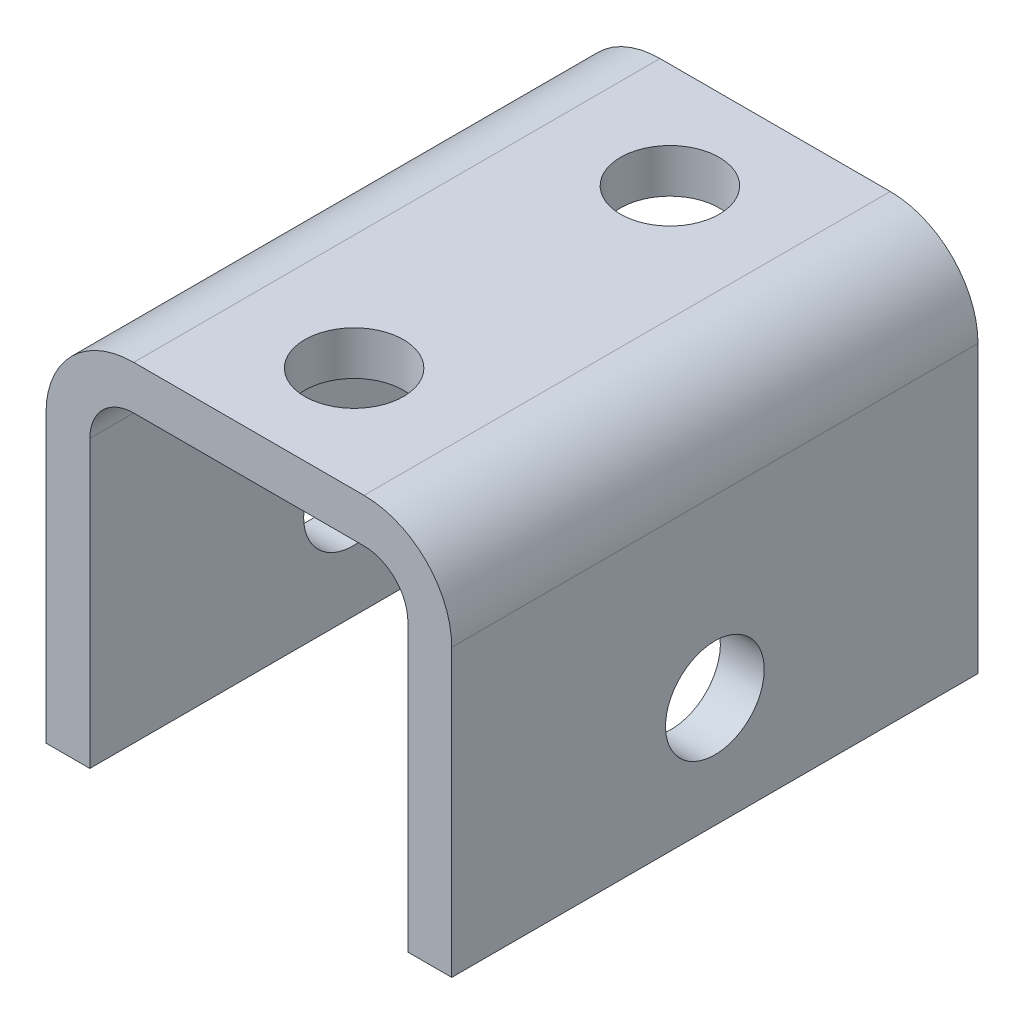
ISO-10303-21;
HEADER;
FILE_DESCRIPTION(('STEP AP214'),'2;1');
FILE_NAME('part.step','',(''),(''),'','','');
FILE_SCHEMA(('AUTOMOTIVE_DESIGN { 1 0 10303 214 1 1 1 1 }'));
ENDSEC;
DATA;
#1=APPLICATION_CONTEXT('core data for automotive mechanical design processes');
#2=APPLICATION_PROTOCOL_DEFINITION('international standard','automotive_design',2000,#1);
#3=PRODUCT_CONTEXT('',#1,'mechanical');
#4=PRODUCT('Part','Part','',(#3));
#5=PRODUCT_RELATED_PRODUCT_CATEGORY('part','',(#4));
#6=PRODUCT_DEFINITION_FORMATION('','',#4);
#7=PRODUCT_DEFINITION_CONTEXT('part definition',#1,'design');
#8=PRODUCT_DEFINITION('design','',#6,#7);
#9=PRODUCT_DEFINITION_SHAPE('','',#8);
#10=(LENGTH_UNIT() NAMED_UNIT(*) SI_UNIT(.MILLI.,.METRE.));
#11=(NAMED_UNIT(*) PLANE_ANGLE_UNIT() SI_UNIT($,.RADIAN.));
#12=(NAMED_UNIT(*) SI_UNIT($,.STERADIAN.) SOLID_ANGLE_UNIT());
#13=UNCERTAINTY_MEASURE_WITH_UNIT(LENGTH_MEASURE(1.E-05),#10,'distance_accuracy_value','');
#14=(GEOMETRIC_REPRESENTATION_CONTEXT(3) GLOBAL_UNCERTAINTY_ASSIGNED_CONTEXT((#13)) GLOBAL_UNIT_ASSIGNED_CONTEXT((#10,
#11,#12)) REPRESENTATION_CONTEXT('',''));
#15=CARTESIAN_POINT('',(0.,0.,0.));
#16=DIRECTION('',(0.,0.,1.));
#17=DIRECTION('',(1.,0.,0.));
#18=AXIS2_PLACEMENT_3D('',#15,#16,#17);
#19=CARTESIAN_POINT('',(23.0251,-54.102,38.1));
#20=DIRECTION('',(0.,1.,0.));
#21=DIRECTION('',(0.,0.,1.));
#22=AXIS2_PLACEMENT_3D('',#19,#20,#21);
#23=PLANE('',#22);
#24=DIRECTION('',(1.,0.,0.));
#25=VECTOR('',#24,1.);
#26=CARTESIAN_POINT('',(23.0251,-54.102,-38.1));
#27=LINE('',#26,#25);
#28=CARTESIAN_POINT('',(23.0251,-54.102,-38.1));
#29=VERTEX_POINT('',#28);
#30=CARTESIAN_POINT('',(29.3751,-54.102,-38.1));
#31=VERTEX_POINT('',#30);
#32=EDGE_CURVE('E156',#29,#31,#27,.T.);
#33=ORIENTED_EDGE('',*,*,#32,.T.);
#34=DIRECTION('',(0.,0.,-1.));
#35=VECTOR('',#34,1.);
#36=CARTESIAN_POINT('',(29.3751,-54.102,38.1));
#37=LINE('',#36,#35);
#38=CARTESIAN_POINT('',(29.3751,-54.102,38.1));
#39=VERTEX_POINT('',#38);
#40=EDGE_CURVE('E11',#39,#31,#37,.T.);
#41=ORIENTED_EDGE('',*,*,#40,.F.);
#42=DIRECTION('',(1.,0.,0.));
#43=VECTOR('',#42,1.);
#44=CARTESIAN_POINT('',(23.0251,-54.102,38.1));
#45=LINE('',#44,#43);
#46=CARTESIAN_POINT('',(23.0251,-54.102,38.1));
#47=VERTEX_POINT('',#46);
#48=EDGE_CURVE('E179',#47,#39,#45,.T.);
#49=ORIENTED_EDGE('',*,*,#48,.F.);
#50=DIRECTION('',(0.,0.,-1.));
#51=VECTOR('',#50,1.);
#52=CARTESIAN_POINT('',(23.0251,-54.102,38.1));
#53=LINE('',#52,#51);
#54=EDGE_CURVE('E152',#47,#29,#53,.T.);
#55=ORIENTED_EDGE('',*,*,#54,.T.);
#56=EDGE_LOOP('',(#33,#41,#49,#55));
#57=FACE_BOUND('',#56,.T.);
#58=ADVANCED_FACE('F34',(#57),#23,.F.);
#59=CARTESIAN_POINT('',(29.3751,-12.7,38.1));
#60=DIRECTION('',(-1.,0.,0.));
#61=DIRECTION('',(0.,-1.,0.));
#62=AXIS2_PLACEMENT_3D('',#59,#60,#61);
#63=PLANE('',#62);
#64=CARTESIAN_POINT('',(29.3751,-38.1,0.));
#65=DIRECTION('',(1.,0.,0.));
#66=DIRECTION('',(0.,1.,0.));
#67=AXIS2_PLACEMENT_3D('',#64,#65,#66);
#68=CIRCLE('',#67,7.14375);
#69=CARTESIAN_POINT('',(29.3751,-30.95625,0.));
#70=VERTEX_POINT('',#69);
#71=EDGE_CURVE('E212',#70,#70,#68,.T.);
#72=ORIENTED_EDGE('',*,*,#71,.F.);
#73=EDGE_LOOP('',(#72));
#74=FACE_BOUND('',#73,.T.);
#75=DIRECTION('',(0.,1.,0.));
#76=VECTOR('',#75,1.);
#77=CARTESIAN_POINT('',(29.3751,-12.7,-38.1));
#78=LINE('',#77,#76);
#79=CARTESIAN_POINT('',(29.3751,-12.7,-38.1));
#80=VERTEX_POINT('',#79);
#81=EDGE_CURVE('E159',#31,#80,#78,.T.);
#82=ORIENTED_EDGE('',*,*,#81,.T.);
#83=DIRECTION('',(0.,0.,-1.));
#84=VECTOR('',#83,1.);
#85=CARTESIAN_POINT('',(29.3751,-12.7,38.1));
#86=LINE('',#85,#84);
#87=CARTESIAN_POINT('',(29.3751,-12.7,38.1));
#88=VERTEX_POINT('',#87);
#89=EDGE_CURVE('E43',#88,#80,#86,.T.);
#90=ORIENTED_EDGE('',*,*,#89,.F.);
#91=DIRECTION('',(0.,1.,0.));
#92=VECTOR('',#91,1.);
#93=CARTESIAN_POINT('',(29.3751,-12.7,38.1));
#94=LINE('',#93,#92);
#95=EDGE_CURVE('E107',#39,#88,#94,.T.);
#96=ORIENTED_EDGE('',*,*,#95,.F.);
#97=ORIENTED_EDGE('',*,*,#40,.T.);
#98=EDGE_LOOP('',(#82,#90,#96,#97));
#99=FACE_BOUND('',#98,.T.);
#100=ADVANCED_FACE('F269',(#74,#99),#63,.F.);
#101=CARTESIAN_POINT('',(16.6751,-12.7,38.1));
#102=DIRECTION('',(0.,0.,-1.));
#103=DIRECTION('',(-1.,0.,0.));
#104=AXIS2_PLACEMENT_3D('',#101,#102,#103);
#105=CYLINDRICAL_SURFACE('',#104,12.7);
#106=CARTESIAN_POINT('',(16.6751,-12.7,-38.1));
#107=DIRECTION('',(0.,0.,1.));
#108=DIRECTION('',(-1.,0.,0.));
#109=AXIS2_PLACEMENT_3D('',#106,#107,#108);
#110=CIRCLE('',#109,12.7);
#111=CARTESIAN_POINT('',(16.6751,0.,-38.1));
#112=VERTEX_POINT('',#111);
#113=EDGE_CURVE('E162',#80,#112,#110,.T.);
#114=ORIENTED_EDGE('',*,*,#113,.T.);
#115=DIRECTION('',(0.,0.,-1.));
#116=VECTOR('',#115,1.);
#117=CARTESIAN_POINT('',(16.6751,0.,38.1));
#118=LINE('',#117,#116);
#119=CARTESIAN_POINT('',(16.6751,0.,38.1));
#120=VERTEX_POINT('',#119);
#121=EDGE_CURVE('E198',#120,#112,#118,.T.);
#122=ORIENTED_EDGE('',*,*,#121,.F.);
#123=CARTESIAN_POINT('',(16.6751,-12.7,38.1));
#124=DIRECTION('',(0.,0.,1.));
#125=DIRECTION('',(-1.,0.,0.));
#126=AXIS2_PLACEMENT_3D('',#123,#124,#125);
#127=CIRCLE('',#126,12.7);
#128=EDGE_CURVE('E229',#88,#120,#127,.T.);
#129=ORIENTED_EDGE('',*,*,#128,.F.);
#130=ORIENTED_EDGE('',*,*,#89,.T.);
#131=EDGE_LOOP('',(#114,#122,#129,#130));
#132=FACE_BOUND('',#131,.T.);
#133=ADVANCED_FACE('F273',(#132),#105,.T.);
#134=CARTESIAN_POINT('',(-16.6751,0.,38.1));
#135=DIRECTION('',(0.,-1.,0.));
#136=DIRECTION('',(0.,0.,-1.));
#137=AXIS2_PLACEMENT_3D('',#134,#135,#136);
#138=PLANE('',#137);
#139=CARTESIAN_POINT('',(0.,0.,-22.86));
#140=DIRECTION('',(0.,1.,0.));
#141=DIRECTION('',(0.,0.,1.));
#142=AXIS2_PLACEMENT_3D('',#139,#140,#141);
#143=CIRCLE('',#142,7.14375);
#144=CARTESIAN_POINT('',(0.,0.,-15.71625));
#145=VERTEX_POINT('',#144);
#146=EDGE_CURVE('E208',#145,#145,#143,.T.);
#147=ORIENTED_EDGE('',*,*,#146,.F.);
#148=EDGE_LOOP('',(#147));
#149=FACE_BOUND('',#148,.T.);
#150=CARTESIAN_POINT('',(0.,0.,22.86));
#151=DIRECTION('',(0.,1.,0.));
#152=DIRECTION('',(0.,0.,1.));
#153=AXIS2_PLACEMENT_3D('',#150,#151,#152);
#154=CIRCLE('',#153,7.14375);
#155=CARTESIAN_POINT('',(0.,0.,30.00375));
#156=VERTEX_POINT('',#155);
#157=EDGE_CURVE('E214',#156,#156,#154,.T.);
#158=ORIENTED_EDGE('',*,*,#157,.F.);
#159=EDGE_LOOP('',(#158));
#160=FACE_BOUND('',#159,.T.);
#161=DIRECTION('',(-1.,0.,0.));
#162=VECTOR('',#161,1.);
#163=CARTESIAN_POINT('',(-16.6751,0.,-38.1));
#164=LINE('',#163,#162);
#165=CARTESIAN_POINT('',(-16.6751,0.,-38.1));
#166=VERTEX_POINT('',#165);
#167=EDGE_CURVE('E164',#112,#166,#164,.T.);
#168=ORIENTED_EDGE('',*,*,#167,.T.);
#169=DIRECTION('',(0.,0.,-1.));
#170=VECTOR('',#169,1.);
#171=CARTESIAN_POINT('',(-16.6751,0.,38.1));
#172=LINE('',#171,#170);
#173=CARTESIAN_POINT('',(-16.6751,0.,38.1));
#174=VERTEX_POINT('',#173);
#175=EDGE_CURVE('E195',#174,#166,#172,.T.);
#176=ORIENTED_EDGE('',*,*,#175,.F.);
#177=DIRECTION('',(-1.,0.,0.));
#178=VECTOR('',#177,1.);
#179=CARTESIAN_POINT('',(-16.6751,0.,38.1));
#180=LINE('',#179,#178);
#181=EDGE_CURVE('E231',#120,#174,#180,.T.);
#182=ORIENTED_EDGE('',*,*,#181,.F.);
#183=ORIENTED_EDGE('',*,*,#121,.T.);
#184=EDGE_LOOP('',(#168,#176,#182,#183));
#185=FACE_BOUND('',#184,.T.);
#186=ADVANCED_FACE('F278',(#149,#160,#185),#138,.F.);
#187=CARTESIAN_POINT('',(-16.6751,-12.7,38.1));
#188=DIRECTION('',(0.,0.,-1.));
#189=DIRECTION('',(-1.,0.,0.));
#190=AXIS2_PLACEMENT_3D('',#187,#188,#189);
#191=CYLINDRICAL_SURFACE('',#190,12.7);
#192=CARTESIAN_POINT('',(-16.6751,-12.7,-38.1));
#193=DIRECTION('',(0.,0.,1.));
#194=DIRECTION('',(1.,0.,0.));
#195=AXIS2_PLACEMENT_3D('',#192,#193,#194);
#196=CIRCLE('',#195,12.7);
#197=CARTESIAN_POINT('',(-29.3751,-12.7,-38.1));
#198=VERTEX_POINT('',#197);
#199=EDGE_CURVE('E166',#166,#198,#196,.T.);
#200=ORIENTED_EDGE('',*,*,#199,.T.);
#201=DIRECTION('',(0.,0.,-1.));
#202=VECTOR('',#201,1.);
#203=CARTESIAN_POINT('',(-29.3751,-12.7,38.1));
#204=LINE('',#203,#202);
#205=CARTESIAN_POINT('',(-29.3751,-12.7,38.1));
#206=VERTEX_POINT('',#205);
#207=EDGE_CURVE('E192',#206,#198,#204,.T.);
#208=ORIENTED_EDGE('',*,*,#207,.F.);
#209=CARTESIAN_POINT('',(-16.6751,-12.7,38.1));
#210=DIRECTION('',(0.,0.,1.));
#211=DIRECTION('',(1.,0.,0.));
#212=AXIS2_PLACEMENT_3D('',#209,#210,#211);
#213=CIRCLE('',#212,12.7);
#214=EDGE_CURVE('E233',#174,#206,#213,.T.);
#215=ORIENTED_EDGE('',*,*,#214,.F.);
#216=ORIENTED_EDGE('',*,*,#175,.T.);
#217=EDGE_LOOP('',(#200,#208,#215,#216));
#218=FACE_BOUND('',#217,.T.);
#219=ADVANCED_FACE('F285',(#218),#191,.T.);
#220=CARTESIAN_POINT('',(-29.3751,-12.7,38.1));
#221=DIRECTION('',(1.,0.,0.));
#222=DIRECTION('',(0.,1.,0.));
#223=AXIS2_PLACEMENT_3D('',#220,#221,#222);
#224=PLANE('',#223);
#225=CARTESIAN_POINT('',(-29.3751,-38.1,0.));
#226=DIRECTION('',(1.,0.,0.));
#227=DIRECTION('',(0.,1.,0.));
#228=AXIS2_PLACEMENT_3D('',#225,#226,#227);
#229=CIRCLE('',#228,7.14375);
#230=CARTESIAN_POINT('',(-29.3751,-30.95625,0.));
#231=VERTEX_POINT('',#230);
#232=EDGE_CURVE('E205',#231,#231,#229,.T.);
#233=ORIENTED_EDGE('',*,*,#232,.T.);
#234=EDGE_LOOP('',(#233));
#235=FACE_BOUND('',#234,.T.);
#236=DIRECTION('',(0.,-1.,0.));
#237=VECTOR('',#236,1.);
#238=CARTESIAN_POINT('',(-29.3751,-12.7,-38.1));
#239=LINE('',#238,#237);
#240=CARTESIAN_POINT('',(-29.3751,-54.102,-38.1));
#241=VERTEX_POINT('',#240);
#242=EDGE_CURVE('E168',#198,#241,#239,.T.);
#243=ORIENTED_EDGE('',*,*,#242,.T.);
#244=DIRECTION('',(0.,0.,-1.));
#245=VECTOR('',#244,1.);
#246=CARTESIAN_POINT('',(-29.3751,-54.102,38.1));
#247=LINE('',#246,#245);
#248=CARTESIAN_POINT('',(-29.3751,-54.102,38.1));
#249=VERTEX_POINT('',#248);
#250=EDGE_CURVE('E189',#249,#241,#247,.T.);
#251=ORIENTED_EDGE('',*,*,#250,.F.);
#252=DIRECTION('',(0.,-1.,0.));
#253=VECTOR('',#252,1.);
#254=CARTESIAN_POINT('',(-29.3751,-12.7,38.1));
#255=LINE('',#254,#253);
#256=EDGE_CURVE('E235',#206,#249,#255,.T.);
#257=ORIENTED_EDGE('',*,*,#256,.F.);
#258=ORIENTED_EDGE('',*,*,#207,.T.);
#259=EDGE_LOOP('',(#243,#251,#257,#258));
#260=FACE_BOUND('',#259,.T.);
#261=ADVANCED_FACE('F289',(#235,#260),#224,.F.);
#262=CARTESIAN_POINT('',(-29.3751,-54.102,38.1));
#263=DIRECTION('',(0.,1.,0.));
#264=DIRECTION('',(0.,0.,1.));
#265=AXIS2_PLACEMENT_3D('',#262,#263,#264);
#266=PLANE('',#265);
#267=DIRECTION('',(1.,0.,0.));
#268=VECTOR('',#267,1.);
#269=CARTESIAN_POINT('',(-29.3751,-54.102,-38.1));
#270=LINE('',#269,#268);
#271=CARTESIAN_POINT('',(-23.0251,-54.102,-38.1));
#272=VERTEX_POINT('',#271);
#273=EDGE_CURVE('E170',#241,#272,#270,.T.);
#274=ORIENTED_EDGE('',*,*,#273,.T.);
#275=DIRECTION('',(0.,0.,-1.));
#276=VECTOR('',#275,1.);
#277=CARTESIAN_POINT('',(-23.0251,-54.102,38.1));
#278=LINE('',#277,#276);
#279=CARTESIAN_POINT('',(-23.0251,-54.102,38.1));
#280=VERTEX_POINT('',#279);
#281=EDGE_CURVE('E186',#280,#272,#278,.T.);
#282=ORIENTED_EDGE('',*,*,#281,.F.);
#283=DIRECTION('',(1.,0.,0.));
#284=VECTOR('',#283,1.);
#285=CARTESIAN_POINT('',(-29.3751,-54.102,38.1));
#286=LINE('',#285,#284);
#287=EDGE_CURVE('E237',#249,#280,#286,.T.);
#288=ORIENTED_EDGE('',*,*,#287,.F.);
#289=ORIENTED_EDGE('',*,*,#250,.T.);
#290=EDGE_LOOP('',(#274,#282,#288,#289));
#291=FACE_BOUND('',#290,.T.);
#292=ADVANCED_FACE('F293',(#291),#266,.F.);
#293=CARTESIAN_POINT('',(-23.0251,-12.7,38.1));
#294=DIRECTION('',(-1.,0.,0.));
#295=DIRECTION('',(0.,0.,1.));
#296=AXIS2_PLACEMENT_3D('',#293,#294,#295);
#297=PLANE('',#296);
#298=CARTESIAN_POINT('',(-23.0251,-38.1,0.));
#299=DIRECTION('',(-1.,0.,0.));
#300=DIRECTION('',(0.,0.,1.));
#301=AXIS2_PLACEMENT_3D('',#298,#299,#300);
#302=CIRCLE('',#301,7.14375);
#303=CARTESIAN_POINT('',(-23.0251,-38.1,7.14375));
#304=VERTEX_POINT('',#303);
#305=EDGE_CURVE('E160',#304,#304,#302,.T.);
#306=ORIENTED_EDGE('',*,*,#305,.T.);
#307=EDGE_LOOP('',(#306));
#308=FACE_BOUND('',#307,.T.);
#309=DIRECTION('',(0.,1.,0.));
#310=VECTOR('',#309,1.);
#311=CARTESIAN_POINT('',(-23.0251,-12.7,-38.1));
#312=LINE('',#311,#310);
#313=CARTESIAN_POINT('',(-23.0251,-12.7,-38.1));
#314=VERTEX_POINT('',#313);
#315=EDGE_CURVE('E172',#272,#314,#312,.T.);
#316=ORIENTED_EDGE('',*,*,#315,.T.);
#317=DIRECTION('',(0.,0.,-1.));
#318=VECTOR('',#317,1.);
#319=CARTESIAN_POINT('',(-23.0251,-12.7,38.1));
#320=LINE('',#319,#318);
#321=CARTESIAN_POINT('',(-23.0251,-12.7,38.1));
#322=VERTEX_POINT('',#321);
#323=EDGE_CURVE('E183',#322,#314,#320,.T.);
#324=ORIENTED_EDGE('',*,*,#323,.F.);
#325=DIRECTION('',(0.,1.,0.));
#326=VECTOR('',#325,1.);
#327=CARTESIAN_POINT('',(-23.0251,-12.7,38.1));
#328=LINE('',#327,#326);
#329=EDGE_CURVE('E239',#280,#322,#328,.T.);
#330=ORIENTED_EDGE('',*,*,#329,.F.);
#331=ORIENTED_EDGE('',*,*,#281,.T.);
#332=EDGE_LOOP('',(#316,#324,#330,#331));
#333=FACE_BOUND('',#332,.T.);
#334=ADVANCED_FACE('F245',(#308,#333),#297,.F.);
#335=CARTESIAN_POINT('',(-16.6751,-12.7,38.1));
#336=DIRECTION('',(0.,0.,-1.));
#337=DIRECTION('',(-1.,0.,0.));
#338=AXIS2_PLACEMENT_3D('',#335,#336,#337);
#339=CYLINDRICAL_SURFACE('',#338,6.35);
#340=CARTESIAN_POINT('',(-16.6751,-12.7,-38.1));
#341=DIRECTION('',(0.,0.,-1.));
#342=DIRECTION('',(1.,0.,0.));
#343=AXIS2_PLACEMENT_3D('',#340,#341,#342);
#344=CIRCLE('',#343,6.35);
#345=CARTESIAN_POINT('',(-16.6751,-6.35,-38.1));
#346=VERTEX_POINT('',#345);
#347=EDGE_CURVE('E174',#314,#346,#344,.T.);
#348=ORIENTED_EDGE('',*,*,#347,.T.);
#349=DIRECTION('',(0.,0.,-1.));
#350=VECTOR('',#349,1.);
#351=CARTESIAN_POINT('',(-16.6751,-6.35,38.1));
#352=LINE('',#351,#350);
#353=CARTESIAN_POINT('',(-16.6751,-6.35,38.1));
#354=VERTEX_POINT('',#353);
#355=EDGE_CURVE('E147',#354,#346,#352,.T.);
#356=ORIENTED_EDGE('',*,*,#355,.F.);
#357=CARTESIAN_POINT('',(-16.6751,-12.7,38.1));
#358=DIRECTION('',(0.,0.,-1.));
#359=DIRECTION('',(1.,0.,0.));
#360=AXIS2_PLACEMENT_3D('',#357,#358,#359);
#361=CIRCLE('',#360,6.35);
#362=EDGE_CURVE('E138',#322,#354,#361,.T.);
#363=ORIENTED_EDGE('',*,*,#362,.F.);
#364=ORIENTED_EDGE('',*,*,#323,.T.);
#365=EDGE_LOOP('',(#348,#356,#363,#364));
#366=FACE_BOUND('',#365,.T.);
#367=ADVANCED_FACE('F249',(#366),#339,.F.);
#368=CARTESIAN_POINT('',(-16.6751,-6.35,38.1));
#369=DIRECTION('',(0.,1.,0.));
#370=DIRECTION('',(0.,0.,1.));
#371=AXIS2_PLACEMENT_3D('',#368,#369,#370);
#372=PLANE('',#371);
#373=CARTESIAN_POINT('',(0.,-6.35,-22.86));
#374=DIRECTION('',(0.,1.,0.));
#375=DIRECTION('',(0.,0.,1.));
#376=AXIS2_PLACEMENT_3D('',#373,#374,#375);
#377=CIRCLE('',#376,7.14375);
#378=CARTESIAN_POINT('',(0.,-6.35,-15.71625));
#379=VERTEX_POINT('',#378);
#380=EDGE_CURVE('E37',#379,#379,#377,.T.);
#381=ORIENTED_EDGE('',*,*,#380,.T.);
#382=EDGE_LOOP('',(#381));
#383=FACE_BOUND('',#382,.T.);
#384=CARTESIAN_POINT('',(0.,-6.35,22.86));
#385=DIRECTION('',(0.,1.,0.));
#386=DIRECTION('',(0.,0.,1.));
#387=AXIS2_PLACEMENT_3D('',#384,#385,#386);
#388=CIRCLE('',#387,7.14375);
#389=CARTESIAN_POINT('',(0.,-6.35,30.00375));
#390=VERTEX_POINT('',#389);
#391=EDGE_CURVE('E206',#390,#390,#388,.T.);
#392=ORIENTED_EDGE('',*,*,#391,.T.);
#393=EDGE_LOOP('',(#392));
#394=FACE_BOUND('',#393,.T.);
#395=DIRECTION('',(1.,0.,0.));
#396=VECTOR('',#395,1.);
#397=CARTESIAN_POINT('',(-16.6751,-6.35,-38.1));
#398=LINE('',#397,#396);
#399=CARTESIAN_POINT('',(16.6751,-6.35,-38.1));
#400=VERTEX_POINT('',#399);
#401=EDGE_CURVE('E146',#346,#400,#398,.T.);
#402=ORIENTED_EDGE('',*,*,#401,.T.);
#403=DIRECTION('',(0.,0.,-1.));
#404=VECTOR('',#403,1.);
#405=CARTESIAN_POINT('',(16.6751,-6.35,38.1));
#406=LINE('',#405,#404);
#407=CARTESIAN_POINT('',(16.6751,-6.35,38.1));
#408=VERTEX_POINT('',#407);
#409=EDGE_CURVE('E143',#408,#400,#406,.T.);
#410=ORIENTED_EDGE('',*,*,#409,.F.);
#411=DIRECTION('',(1.,0.,0.));
#412=VECTOR('',#411,1.);
#413=CARTESIAN_POINT('',(-16.6751,-6.35,38.1));
#414=LINE('',#413,#412);
#415=EDGE_CURVE('E132',#354,#408,#414,.T.);
#416=ORIENTED_EDGE('',*,*,#415,.F.);
#417=ORIENTED_EDGE('',*,*,#355,.T.);
#418=EDGE_LOOP('',(#402,#410,#416,#417));
#419=FACE_BOUND('',#418,.T.);
#420=ADVANCED_FACE('F144',(#383,#394,#419),#372,.F.);
#421=CARTESIAN_POINT('',(16.6751,-12.7,38.1));
#422=DIRECTION('',(0.,0.,-1.));
#423=DIRECTION('',(-1.,0.,0.));
#424=AXIS2_PLACEMENT_3D('',#421,#422,#423);
#425=CYLINDRICAL_SURFACE('',#424,6.35);
#426=CARTESIAN_POINT('',(16.6751,-12.7,-38.1));
#427=DIRECTION('',(0.,0.,-1.));
#428=DIRECTION('',(-1.,0.,0.));
#429=AXIS2_PLACEMENT_3D('',#426,#427,#428);
#430=CIRCLE('',#429,6.35);
#431=CARTESIAN_POINT('',(23.0251,-12.7,-38.1));
#432=VERTEX_POINT('',#431);
#433=EDGE_CURVE('E93',#400,#432,#430,.T.);
#434=ORIENTED_EDGE('',*,*,#433,.T.);
#435=DIRECTION('',(0.,0.,-1.));
#436=VECTOR('',#435,1.);
#437=CARTESIAN_POINT('',(23.0251,-12.7,38.1));
#438=LINE('',#437,#436);
#439=CARTESIAN_POINT('',(23.0251,-12.7,38.1));
#440=VERTEX_POINT('',#439);
#441=EDGE_CURVE('E148',#440,#432,#438,.T.);
#442=ORIENTED_EDGE('',*,*,#441,.F.);
#443=CARTESIAN_POINT('',(16.6751,-12.7,38.1));
#444=DIRECTION('',(0.,0.,-1.));
#445=DIRECTION('',(-1.,0.,0.));
#446=AXIS2_PLACEMENT_3D('',#443,#444,#445);
#447=CIRCLE('',#446,6.35);
#448=EDGE_CURVE('E136',#408,#440,#447,.T.);
#449=ORIENTED_EDGE('',*,*,#448,.F.);
#450=ORIENTED_EDGE('',*,*,#409,.T.);
#451=EDGE_LOOP('',(#434,#442,#449,#450));
#452=FACE_BOUND('',#451,.T.);
#453=ADVANCED_FACE('F150',(#452),#425,.F.);
#454=CARTESIAN_POINT('',(23.0251,-12.7,38.1));
#455=DIRECTION('',(1.,0.,0.));
#456=DIRECTION('',(0.,1.,0.));
#457=AXIS2_PLACEMENT_3D('',#454,#455,#456);
#458=PLANE('',#457);
#459=CARTESIAN_POINT('',(23.0251,-38.1,0.));
#460=DIRECTION('',(1.,0.,0.));
#461=DIRECTION('',(0.,1.,0.));
#462=AXIS2_PLACEMENT_3D('',#459,#460,#461);
#463=CIRCLE('',#462,7.14375);
#464=CARTESIAN_POINT('',(23.0251,-30.95625,0.));
#465=VERTEX_POINT('',#464);
#466=EDGE_CURVE('E203',#465,#465,#463,.T.);
#467=ORIENTED_EDGE('',*,*,#466,.T.);
#468=EDGE_LOOP('',(#467));
#469=FACE_BOUND('',#468,.T.);
#470=DIRECTION('',(0.,-1.,0.));
#471=VECTOR('',#470,1.);
#472=CARTESIAN_POINT('',(23.0251,-12.7,-38.1));
#473=LINE('',#472,#471);
#474=EDGE_CURVE('E99',#432,#29,#473,.T.);
#475=ORIENTED_EDGE('',*,*,#474,.T.);
#476=ORIENTED_EDGE('',*,*,#54,.F.);
#477=DIRECTION('',(0.,-1.,0.));
#478=VECTOR('',#477,1.);
#479=CARTESIAN_POINT('',(23.0251,-12.7,38.1));
#480=LINE('',#479,#478);
#481=EDGE_CURVE('E52',#440,#47,#480,.T.);
#482=ORIENTED_EDGE('',*,*,#481,.F.);
#483=ORIENTED_EDGE('',*,*,#441,.T.);
#484=EDGE_LOOP('',(#475,#476,#482,#483));
#485=FACE_BOUND('',#484,.T.);
#486=ADVANCED_FACE('F257',(#469,#485),#458,.F.);
#487=CARTESIAN_POINT('',(16.6751,-12.7,38.1));
#488=DIRECTION('',(0.,0.,-1.));
#489=DIRECTION('',(-1.,0.,0.));
#490=AXIS2_PLACEMENT_3D('',#487,#488,#489);
#491=PLANE('',#490);
#492=ORIENTED_EDGE('',*,*,#48,.T.);
#493=ORIENTED_EDGE('',*,*,#95,.T.);
#494=ORIENTED_EDGE('',*,*,#128,.T.);
#495=ORIENTED_EDGE('',*,*,#181,.T.);
#496=ORIENTED_EDGE('',*,*,#214,.T.);
#497=ORIENTED_EDGE('',*,*,#256,.T.);
#498=ORIENTED_EDGE('',*,*,#287,.T.);
#499=ORIENTED_EDGE('',*,*,#329,.T.);
#500=ORIENTED_EDGE('',*,*,#362,.T.);
#501=ORIENTED_EDGE('',*,*,#415,.T.);
#502=ORIENTED_EDGE('',*,*,#448,.T.);
#503=ORIENTED_EDGE('',*,*,#481,.T.);
#504=EDGE_LOOP('',(#492,#493,#494,#495,#496,#497,#498,#499,#500,#501,#502,#503));
#505=FACE_BOUND('',#504,.T.);
#506=ADVANCED_FACE('F134',(#505),#491,.F.);
#507=CARTESIAN_POINT('',(16.6751,-12.7,-38.1));
#508=DIRECTION('',(0.,0.,-1.));
#509=DIRECTION('',(-1.,0.,0.));
#510=AXIS2_PLACEMENT_3D('',#507,#508,#509);
#511=PLANE('',#510);
#512=ORIENTED_EDGE('',*,*,#32,.F.);
#513=ORIENTED_EDGE('',*,*,#474,.F.);
#514=ORIENTED_EDGE('',*,*,#433,.F.);
#515=ORIENTED_EDGE('',*,*,#401,.F.);
#516=ORIENTED_EDGE('',*,*,#347,.F.);
#517=ORIENTED_EDGE('',*,*,#315,.F.);
#518=ORIENTED_EDGE('',*,*,#273,.F.);
#519=ORIENTED_EDGE('',*,*,#242,.F.);
#520=ORIENTED_EDGE('',*,*,#199,.F.);
#521=ORIENTED_EDGE('',*,*,#167,.F.);
#522=ORIENTED_EDGE('',*,*,#113,.F.);
#523=ORIENTED_EDGE('',*,*,#81,.F.);
#524=EDGE_LOOP('',(#512,#513,#514,#515,#516,#517,#518,#519,#520,#521,#522,#523));
#525=FACE_BOUND('',#524,.T.);
#526=ADVANCED_FACE('F252',(#525),#511,.T.);
#527=CARTESIAN_POINT('',(-29.3751,-38.1,0.));
#528=DIRECTION('',(1.,0.,0.));
#529=DIRECTION('',(0.,1.,0.));
#530=AXIS2_PLACEMENT_3D('',#527,#528,#529);
#531=CYLINDRICAL_SURFACE('',#530,7.14375);
#532=ORIENTED_EDGE('',*,*,#71,.T.);
#533=EDGE_LOOP('',(#532));
#534=FACE_BOUND('',#533,.T.);
#535=ORIENTED_EDGE('',*,*,#466,.F.);
#536=EDGE_LOOP('',(#535));
#537=FACE_BOUND('',#536,.T.);
#538=ADVANCED_FACE('F321',(#534,#537),#531,.F.);
#539=ORIENTED_EDGE('',*,*,#232,.F.);
#540=EDGE_LOOP('',(#539));
#541=FACE_BOUND('',#540,.T.);
#542=ORIENTED_EDGE('',*,*,#305,.F.);
#543=EDGE_LOOP('',(#542));
#544=FACE_BOUND('',#543,.T.);
#545=ADVANCED_FACE('F316',(#541,#544),#531,.F.);
#546=CARTESIAN_POINT('',(0.,-54.102,22.86));
#547=DIRECTION('',(0.,1.,0.));
#548=DIRECTION('',(0.,0.,1.));
#549=AXIS2_PLACEMENT_3D('',#546,#547,#548);
#550=CYLINDRICAL_SURFACE('',#549,7.14375);
#551=ORIENTED_EDGE('',*,*,#157,.T.);
#552=EDGE_LOOP('',(#551));
#553=FACE_BOUND('',#552,.T.);
#554=ORIENTED_EDGE('',*,*,#391,.F.);
#555=EDGE_LOOP('',(#554));
#556=FACE_BOUND('',#555,.T.);
#557=ADVANCED_FACE('F311',(#553,#556),#550,.F.);
#558=CARTESIAN_POINT('',(0.,-54.102,-22.86));
#559=DIRECTION('',(0.,1.,0.));
#560=DIRECTION('',(0.,0.,1.));
#561=AXIS2_PLACEMENT_3D('',#558,#559,#560);
#562=CYLINDRICAL_SURFACE('',#561,7.14375);
#563=ORIENTED_EDGE('',*,*,#146,.T.);
#564=EDGE_LOOP('',(#563));
#565=FACE_BOUND('',#564,.T.);
#566=ORIENTED_EDGE('',*,*,#380,.F.);
#567=EDGE_LOOP('',(#566));
#568=FACE_BOUND('',#567,.T.);
#569=ADVANCED_FACE('F309',(#565,#568),#562,.F.);
#570=CLOSED_SHELL('',(#58,#100,#133,#186,#219,#261,#292,#334,#367,#420,#453,#486,#506,#526,#538,
#545,#557,#569));
#571=MANIFOLD_SOLID_BREP('B2',#570);
#572=ADVANCED_BREP_SHAPE_REPRESENTATION('',(#18,#571),#14);
#573=SHAPE_DEFINITION_REPRESENTATION(#9,#572);
ENDSEC;
END-ISO-10303-21;
